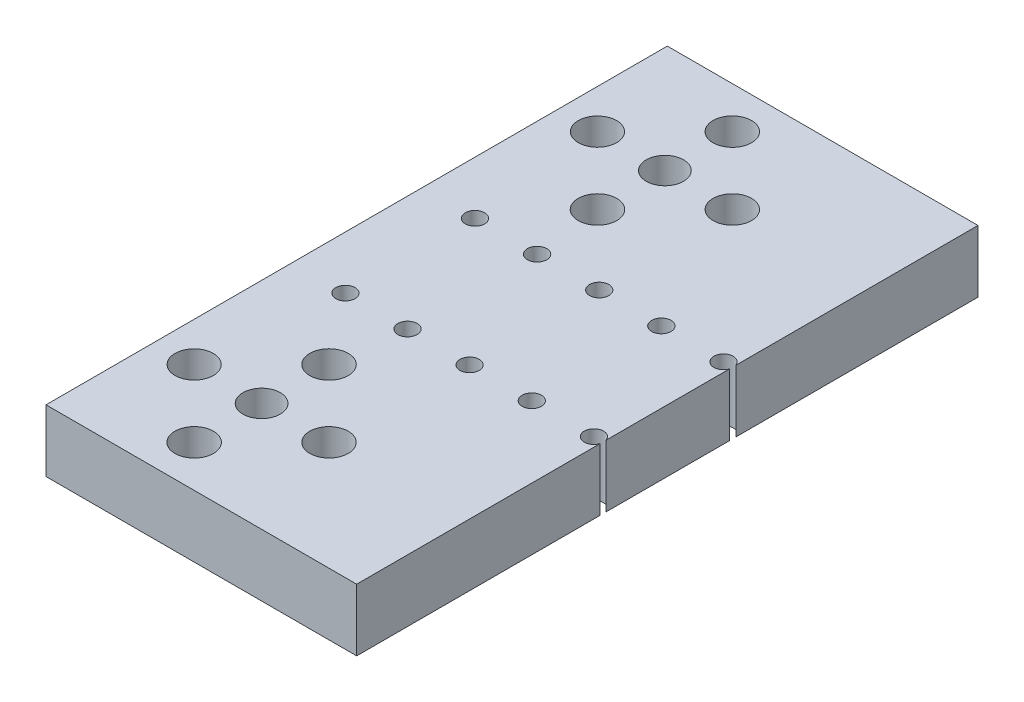
ISO-10303-21;
HEADER;
FILE_DESCRIPTION(('STEP AP214'),'2;1');
FILE_NAME('part.step','',(''),(''),'','','');
FILE_SCHEMA(('AUTOMOTIVE_DESIGN { 1 0 10303 214 1 1 1 1 }'));
ENDSEC;
DATA;
#1=APPLICATION_CONTEXT('core data for automotive mechanical design processes');
#2=APPLICATION_PROTOCOL_DEFINITION('international standard','automotive_design',2000,#1);
#3=PRODUCT_CONTEXT('',#1,'mechanical');
#4=PRODUCT('Part','Part','',(#3));
#5=PRODUCT_RELATED_PRODUCT_CATEGORY('part','',(#4));
#6=PRODUCT_DEFINITION_FORMATION('','',#4);
#7=PRODUCT_DEFINITION_CONTEXT('part definition',#1,'design');
#8=PRODUCT_DEFINITION('design','',#6,#7);
#9=PRODUCT_DEFINITION_SHAPE('','',#8);
#10=(LENGTH_UNIT() NAMED_UNIT(*) SI_UNIT(.MILLI.,.METRE.));
#11=(NAMED_UNIT(*) PLANE_ANGLE_UNIT() SI_UNIT($,.RADIAN.));
#12=(NAMED_UNIT(*) SI_UNIT($,.STERADIAN.) SOLID_ANGLE_UNIT());
#13=UNCERTAINTY_MEASURE_WITH_UNIT(LENGTH_MEASURE(1.E-05),#10,'distance_accuracy_value','');
#14=(GEOMETRIC_REPRESENTATION_CONTEXT(3) GLOBAL_UNCERTAINTY_ASSIGNED_CONTEXT((#13)) GLOBAL_UNIT_ASSIGNED_CONTEXT((#10,
#11,#12)) REPRESENTATION_CONTEXT('',''));
#15=CARTESIAN_POINT('',(0.,0.,0.));
#16=DIRECTION('',(0.,0.,1.));
#17=DIRECTION('',(1.,0.,0.));
#18=AXIS2_PLACEMENT_3D('',#15,#16,#17);
#19=CARTESIAN_POINT('',(0.,10.,50.));
#20=DIRECTION('',(-1.,0.,0.));
#21=DIRECTION('',(0.,0.,1.));
#22=AXIS2_PLACEMENT_3D('',#19,#20,#21);
#23=PLANE('',#22);
#24=DIRECTION('',(0.,0.,-1.));
#25=VECTOR('',#24,1.);
#26=CARTESIAN_POINT('',(0.,0.,50.));
#27=LINE('',#26,#25);
#28=CARTESIAN_POINT('',(0.,0.,50.));
#29=VERTEX_POINT('',#28);
#30=CARTESIAN_POINT('',(0.,0.,10.8216741232352));
#31=VERTEX_POINT('',#30);
#32=EDGE_CURVE('E137',#29,#31,#27,.T.);
#33=ORIENTED_EDGE('',*,*,#32,.T.);
#34=DIRECTION('',(0.,1.,0.));
#35=VECTOR('',#34,1.);
#36=CARTESIAN_POINT('',(0.,0.,10.8216741232352));
#37=LINE('',#36,#35);
#38=CARTESIAN_POINT('',(0.,10.,10.8216741232352));
#39=VERTEX_POINT('',#38);
#40=EDGE_CURVE('E302',#31,#39,#37,.T.);
#41=ORIENTED_EDGE('',*,*,#40,.T.);
#42=DIRECTION('',(0.,0.,-1.));
#43=VECTOR('',#42,1.);
#44=CARTESIAN_POINT('',(0.,10.,50.));
#45=LINE('',#44,#43);
#46=CARTESIAN_POINT('',(0.,10.,50.));
#47=VERTEX_POINT('',#46);
#48=EDGE_CURVE('E128',#47,#39,#45,.T.);
#49=ORIENTED_EDGE('',*,*,#48,.F.);
#50=DIRECTION('',(0.,-1.,0.));
#51=VECTOR('',#50,1.);
#52=CARTESIAN_POINT('',(0.,10.,50.));
#53=LINE('',#52,#51);
#54=EDGE_CURVE('E47',#47,#29,#53,.T.);
#55=ORIENTED_EDGE('',*,*,#54,.T.);
#56=EDGE_LOOP('',(#33,#41,#49,#55));
#57=FACE_BOUND('',#56,.T.);
#58=ADVANCED_FACE('F37',(#57),#23,.F.);
#59=CARTESIAN_POINT('',(0.,10.,9.86524091000437));
#60=VERTEX_POINT('',#59);
#61=CARTESIAN_POINT('',(0.,10.,-10.0134835313561));
#62=VERTEX_POINT('',#61);
#63=EDGE_CURVE('E143',#60,#62,#45,.T.);
#64=ORIENTED_EDGE('',*,*,#63,.F.);
#65=DIRECTION('',(0.,1.,0.));
#66=VECTOR('',#65,1.);
#67=CARTESIAN_POINT('',(0.,0.,9.86524091000437));
#68=LINE('',#67,#66);
#69=CARTESIAN_POINT('',(0.,0.,9.86524091000437));
#70=VERTEX_POINT('',#69);
#71=EDGE_CURVE('E74',#70,#60,#68,.T.);
#72=ORIENTED_EDGE('',*,*,#71,.F.);
#73=CARTESIAN_POINT('',(0.,0.,-10.0134835313561));
#74=VERTEX_POINT('',#73);
#75=EDGE_CURVE('E150',#70,#74,#27,.T.);
#76=ORIENTED_EDGE('',*,*,#75,.T.);
#77=DIRECTION('',(0.,1.,0.));
#78=VECTOR('',#77,1.);
#79=CARTESIAN_POINT('',(0.,0.,-10.0134835313561));
#80=LINE('',#79,#78);
#81=EDGE_CURVE('E56',#74,#62,#80,.T.);
#82=ORIENTED_EDGE('',*,*,#81,.T.);
#83=EDGE_LOOP('',(#64,#72,#76,#82));
#84=FACE_BOUND('',#83,.T.);
#85=ADVANCED_FACE('F343',(#84),#23,.F.);
#86=CARTESIAN_POINT('',(-50.,10.,50.));
#87=DIRECTION('',(1.,0.,0.));
#88=DIRECTION('',(0.,0.,-1.));
#89=AXIS2_PLACEMENT_3D('',#86,#87,#88);
#90=PLANE('',#89);
#91=DIRECTION('',(0.,0.,1.));
#92=VECTOR('',#91,1.);
#93=CARTESIAN_POINT('',(-50.,0.,50.));
#94=LINE('',#93,#92);
#95=CARTESIAN_POINT('',(-50.,0.,-50.));
#96=VERTEX_POINT('',#95);
#97=CARTESIAN_POINT('',(-50.,0.,50.));
#98=VERTEX_POINT('',#97);
#99=EDGE_CURVE('E145',#96,#98,#94,.T.);
#100=ORIENTED_EDGE('',*,*,#99,.T.);
#101=DIRECTION('',(0.,-1.,0.));
#102=VECTOR('',#101,1.);
#103=CARTESIAN_POINT('',(-50.,10.,50.));
#104=LINE('',#103,#102);
#105=CARTESIAN_POINT('',(-50.,10.,50.));
#106=VERTEX_POINT('',#105);
#107=EDGE_CURVE('E11',#106,#98,#104,.T.);
#108=ORIENTED_EDGE('',*,*,#107,.F.);
#109=DIRECTION('',(0.,0.,1.));
#110=VECTOR('',#109,1.);
#111=CARTESIAN_POINT('',(-50.,10.,50.));
#112=LINE('',#111,#110);
#113=CARTESIAN_POINT('',(-50.,10.,-50.));
#114=VERTEX_POINT('',#113);
#115=EDGE_CURVE('E125',#114,#106,#112,.T.);
#116=ORIENTED_EDGE('',*,*,#115,.F.);
#117=DIRECTION('',(0.,-1.,0.));
#118=VECTOR('',#117,1.);
#119=CARTESIAN_POINT('',(-50.,10.,-50.));
#120=LINE('',#119,#118);
#121=EDGE_CURVE('E127',#114,#96,#120,.T.);
#122=ORIENTED_EDGE('',*,*,#121,.T.);
#123=EDGE_LOOP('',(#100,#108,#116,#122));
#124=FACE_BOUND('',#123,.T.);
#125=ADVANCED_FACE('F39',(#124),#90,.F.);
#126=CARTESIAN_POINT('',(0.,10.,50.));
#127=DIRECTION('',(0.,0.,-1.));
#128=DIRECTION('',(-1.,0.,0.));
#129=AXIS2_PLACEMENT_3D('',#126,#127,#128);
#130=PLANE('',#129);
#131=DIRECTION('',(1.,0.,0.));
#132=VECTOR('',#131,1.);
#133=CARTESIAN_POINT('',(0.,0.,50.));
#134=LINE('',#133,#132);
#135=EDGE_CURVE('E85',#98,#29,#134,.T.);
#136=ORIENTED_EDGE('',*,*,#135,.T.);
#137=ORIENTED_EDGE('',*,*,#54,.F.);
#138=DIRECTION('',(1.,0.,0.));
#139=VECTOR('',#138,1.);
#140=CARTESIAN_POINT('',(0.,10.,50.));
#141=LINE('',#140,#139);
#142=EDGE_CURVE('E107',#106,#47,#141,.T.);
#143=ORIENTED_EDGE('',*,*,#142,.F.);
#144=ORIENTED_EDGE('',*,*,#107,.T.);
#145=EDGE_LOOP('',(#136,#137,#143,#144));
#146=FACE_BOUND('',#145,.T.);
#147=ADVANCED_FACE('F351',(#146),#130,.F.);
#148=CARTESIAN_POINT('',(0.,10.,-11.016927156555));
#149=VERTEX_POINT('',#148);
#150=CARTESIAN_POINT('',(0.,10.,-50.));
#151=VERTEX_POINT('',#150);
#152=EDGE_CURVE('E118',#149,#151,#45,.T.);
#153=ORIENTED_EDGE('',*,*,#152,.F.);
#154=DIRECTION('',(0.,1.,0.));
#155=VECTOR('',#154,1.);
#156=CARTESIAN_POINT('',(0.,0.,-11.016927156555));
#157=LINE('',#156,#155);
#158=CARTESIAN_POINT('',(0.,0.,-11.016927156555));
#159=VERTEX_POINT('',#158);
#160=EDGE_CURVE('E293',#159,#149,#157,.T.);
#161=ORIENTED_EDGE('',*,*,#160,.F.);
#162=CARTESIAN_POINT('',(0.,0.,-50.));
#163=VERTEX_POINT('',#162);
#164=EDGE_CURVE('E148',#159,#163,#27,.T.);
#165=ORIENTED_EDGE('',*,*,#164,.T.);
#166=DIRECTION('',(0.,-1.,0.));
#167=VECTOR('',#166,1.);
#168=CARTESIAN_POINT('',(0.,10.,-50.));
#169=LINE('',#168,#167);
#170=EDGE_CURVE('E133',#151,#163,#169,.T.);
#171=ORIENTED_EDGE('',*,*,#170,.F.);
#172=EDGE_LOOP('',(#153,#161,#165,#171));
#173=FACE_BOUND('',#172,.T.);
#174=ADVANCED_FACE('F292',(#173),#23,.F.);
#175=CARTESIAN_POINT('',(0.,10.,-50.));
#176=DIRECTION('',(0.,0.,1.));
#177=DIRECTION('',(1.,0.,0.));
#178=AXIS2_PLACEMENT_3D('',#175,#176,#177);
#179=PLANE('',#178);
#180=DIRECTION('',(-1.,0.,0.));
#181=VECTOR('',#180,1.);
#182=CARTESIAN_POINT('',(0.,0.,-50.));
#183=LINE('',#182,#181);
#184=EDGE_CURVE('E99',#163,#96,#183,.T.);
#185=ORIENTED_EDGE('',*,*,#184,.T.);
#186=ORIENTED_EDGE('',*,*,#121,.F.);
#187=DIRECTION('',(-1.,0.,0.));
#188=VECTOR('',#187,1.);
#189=CARTESIAN_POINT('',(0.,10.,-50.));
#190=LINE('',#189,#188);
#191=EDGE_CURVE('E121',#151,#114,#190,.T.);
#192=ORIENTED_EDGE('',*,*,#191,.F.);
#193=ORIENTED_EDGE('',*,*,#170,.T.);
#194=EDGE_LOOP('',(#185,#186,#192,#193));
#195=FACE_BOUND('',#194,.T.);
#196=ADVANCED_FACE('F130',(#195),#179,.F.);
#197=CARTESIAN_POINT('',(0.,10.,0.));
#198=DIRECTION('',(0.,1.,0.));
#199=DIRECTION('',(0.,0.,1.));
#200=AXIS2_PLACEMENT_3D('',#197,#198,#199);
#201=PLANE('',#200);
#202=CARTESIAN_POINT('',(-21.4743842366077,10.,10.3434575166198));
#203=DIRECTION('',(0.,1.,0.));
#204=DIRECTION('',(0.,0.,1.));
#205=AXIS2_PLACEMENT_3D('',#202,#203,#204);
#206=CIRCLE('',#205,1.54999999999999);
#207=CARTESIAN_POINT('',(-21.4743842366077,10.,11.8934575166198));
#208=VERTEX_POINT('',#207);
#209=EDGE_CURVE('E184',#208,#208,#206,.T.);
#210=ORIENTED_EDGE('',*,*,#209,.F.);
#211=EDGE_LOOP('',(#210));
#212=FACE_BOUND('',#211,.T.);
#213=CARTESIAN_POINT('',(-11.4743842366077,10.,10.3434575166198));
#214=DIRECTION('',(0.,1.,0.));
#215=DIRECTION('',(0.,0.,1.));
#216=AXIS2_PLACEMENT_3D('',#213,#214,#215);
#217=CIRCLE('',#216,1.54999999999999);
#218=CARTESIAN_POINT('',(-11.4743842366077,10.,11.8934575166198));
#219=VERTEX_POINT('',#218);
#220=EDGE_CURVE('E181',#219,#219,#217,.T.);
#221=ORIENTED_EDGE('',*,*,#220,.F.);
#222=EDGE_LOOP('',(#221));
#223=FACE_BOUND('',#222,.T.);
#224=CARTESIAN_POINT('',(-1.47438423660768,10.,10.3434575166198));
#225=DIRECTION('',(0.,1.,0.));
#226=DIRECTION('',(0.,0.,1.));
#227=AXIS2_PLACEMENT_3D('',#224,#225,#226);
#228=CIRCLE('',#227,1.54999999999999);
#229=EDGE_CURVE('E41',#60,#39,#228,.T.);
#230=ORIENTED_EDGE('',*,*,#229,.F.);
#231=ORIENTED_EDGE('',*,*,#63,.T.);
#232=CARTESIAN_POINT('',(-1.47438423660769,10.,-10.5152053439555));
#233=DIRECTION('',(0.,1.,0.));
#234=DIRECTION('',(0.,0.,1.));
#235=AXIS2_PLACEMENT_3D('',#232,#233,#234);
#236=CIRCLE('',#235,1.55741248691389);
#237=EDGE_CURVE('E154',#149,#62,#236,.T.);
#238=ORIENTED_EDGE('',*,*,#237,.F.);
#239=ORIENTED_EDGE('',*,*,#152,.T.);
#240=ORIENTED_EDGE('',*,*,#191,.T.);
#241=ORIENTED_EDGE('',*,*,#115,.T.);
#242=ORIENTED_EDGE('',*,*,#142,.T.);
#243=ORIENTED_EDGE('',*,*,#48,.T.);
#244=EDGE_LOOP('',(#230,#231,#238,#239,#240,#241,#242,#243));
#245=FACE_BOUND('',#244,.T.);
#246=CARTESIAN_POINT('',(-11.4743842366077,10.,-10.5152053439555));
#247=DIRECTION('',(0.,1.,0.));
#248=DIRECTION('',(0.,0.,1.));
#249=AXIS2_PLACEMENT_3D('',#246,#247,#248);
#250=CIRCLE('',#249,1.55741248691389);
#251=CARTESIAN_POINT('',(-11.4743842366077,10.,-8.95779285704164));
#252=VERTEX_POINT('',#251);
#253=EDGE_CURVE('E178',#252,#252,#250,.T.);
#254=ORIENTED_EDGE('',*,*,#253,.F.);
#255=EDGE_LOOP('',(#254));
#256=FACE_BOUND('',#255,.T.);
#257=CARTESIAN_POINT('',(-21.4743842366077,10.,-10.5152053439555));
#258=DIRECTION('',(0.,1.,0.));
#259=DIRECTION('',(0.,0.,1.));
#260=AXIS2_PLACEMENT_3D('',#257,#258,#259);
#261=CIRCLE('',#260,1.55);
#262=CARTESIAN_POINT('',(-21.4743842366077,10.,-8.96520534395554));
#263=VERTEX_POINT('',#262);
#264=EDGE_CURVE('E175',#263,#263,#261,.T.);
#265=ORIENTED_EDGE('',*,*,#264,.F.);
#266=EDGE_LOOP('',(#265));
#267=FACE_BOUND('',#266,.T.);
#268=CARTESIAN_POINT('',(-31.4743842366077,10.,-10.5152053439555));
#269=DIRECTION('',(0.,1.,0.));
#270=DIRECTION('',(0.,0.,1.));
#271=AXIS2_PLACEMENT_3D('',#268,#269,#270);
#272=CIRCLE('',#271,1.55741248691389);
#273=CARTESIAN_POINT('',(-31.4743842366077,10.,-8.95779285704164));
#274=VERTEX_POINT('',#273);
#275=EDGE_CURVE('E172',#274,#274,#272,.T.);
#276=ORIENTED_EDGE('',*,*,#275,.F.);
#277=EDGE_LOOP('',(#276));
#278=FACE_BOUND('',#277,.T.);
#279=CARTESIAN_POINT('',(-31.4743842366077,10.,10.3434575166198));
#280=DIRECTION('',(0.,1.,0.));
#281=DIRECTION('',(0.,0.,1.));
#282=AXIS2_PLACEMENT_3D('',#279,#280,#281);
#283=CIRCLE('',#282,1.54999999999999);
#284=CARTESIAN_POINT('',(-31.4743842366077,10.,11.8934575166198));
#285=VERTEX_POINT('',#284);
#286=EDGE_CURVE('E158',#285,#285,#283,.T.);
#287=ORIENTED_EDGE('',*,*,#286,.F.);
#288=EDGE_LOOP('',(#287));
#289=FACE_BOUND('',#288,.T.);
#290=CARTESIAN_POINT('',(-41.4743842366077,10.,10.3434575166198));
#291=DIRECTION('',(0.,1.,0.));
#292=DIRECTION('',(0.,0.,1.));
#293=AXIS2_PLACEMENT_3D('',#290,#291,#292);
#294=CIRCLE('',#293,1.54999999999999);
#295=CARTESIAN_POINT('',(-41.4743842366077,10.,11.8934575166198));
#296=VERTEX_POINT('',#295);
#297=EDGE_CURVE('E155',#296,#296,#294,.T.);
#298=ORIENTED_EDGE('',*,*,#297,.F.);
#299=EDGE_LOOP('',(#298));
#300=FACE_BOUND('',#299,.T.);
#301=CARTESIAN_POINT('',(-41.4743842366077,10.,-10.5152053439555));
#302=DIRECTION('',(0.,1.,0.));
#303=DIRECTION('',(0.,0.,1.));
#304=AXIS2_PLACEMENT_3D('',#301,#302,#303);
#305=CIRCLE('',#304,1.55741248691389);
#306=CARTESIAN_POINT('',(-41.4743842366077,10.,-8.95779285704164));
#307=VERTEX_POINT('',#306);
#308=EDGE_CURVE('E156',#307,#307,#305,.T.);
#309=ORIENTED_EDGE('',*,*,#308,.F.);
#310=EDGE_LOOP('',(#309));
#311=FACE_BOUND('',#310,.T.);
#312=CARTESIAN_POINT('',(-32.8473086233618,10.,43.305370298214));
#313=DIRECTION('',(0.,1.,0.));
#314=DIRECTION('',(0.,0.,1.));
#315=AXIS2_PLACEMENT_3D('',#312,#313,#314);
#316=CIRCLE('',#315,3.10436221529379);
#317=CARTESIAN_POINT('',(-32.8473086233618,10.,46.4097325135078));
#318=VERTEX_POINT('',#317);
#319=EDGE_CURVE('E140',#318,#318,#316,.T.);
#320=ORIENTED_EDGE('',*,*,#319,.F.);
#321=EDGE_LOOP('',(#320));
#322=FACE_BOUND('',#321,.T.);
#323=CARTESIAN_POINT('',(-32.8473086233618,10.,32.453891525012));
#324=DIRECTION('',(0.,1.,0.));
#325=DIRECTION('',(0.,0.,1.));
#326=AXIS2_PLACEMENT_3D('',#323,#324,#325);
#327=CIRCLE('',#326,3.00452464943322);
#328=CARTESIAN_POINT('',(-32.8473086233618,10.,35.4584161744453));
#329=VERTEX_POINT('',#328);
#330=EDGE_CURVE('E240',#329,#329,#327,.T.);
#331=ORIENTED_EDGE('',*,*,#330,.F.);
#332=EDGE_LOOP('',(#331));
#333=FACE_BOUND('',#332,.T.);
#334=CARTESIAN_POINT('',(-32.8473086233618,10.,21.6024127518101));
#335=DIRECTION('',(0.,1.,0.));
#336=DIRECTION('',(0.,0.,1.));
#337=AXIS2_PLACEMENT_3D('',#334,#335,#336);
#338=CIRCLE('',#337,3.10436221529379);
#339=CARTESIAN_POINT('',(-32.8473086233618,10.,24.7067749671039));
#340=VERTEX_POINT('',#339);
#341=EDGE_CURVE('E238',#340,#340,#338,.T.);
#342=ORIENTED_EDGE('',*,*,#341,.F.);
#343=EDGE_LOOP('',(#342));
#344=FACE_BOUND('',#343,.T.);
#345=CARTESIAN_POINT('',(-21.9958298501599,10.,32.453891525012));
#346=DIRECTION('',(0.,1.,0.));
#347=DIRECTION('',(0.,0.,1.));
#348=AXIS2_PLACEMENT_3D('',#345,#346,#347);
#349=CIRCLE('',#348,3.1);
#350=CARTESIAN_POINT('',(-21.9958298501599,10.,35.553891525012));
#351=VERTEX_POINT('',#350);
#352=EDGE_CURVE('E235',#351,#351,#349,.T.);
#353=ORIENTED_EDGE('',*,*,#352,.F.);
#354=EDGE_LOOP('',(#353));
#355=FACE_BOUND('',#354,.T.);
#356=CARTESIAN_POINT('',(-43.6987873965638,10.,32.453891525012));
#357=DIRECTION('',(0.,1.,0.));
#358=DIRECTION('',(0.,0.,1.));
#359=AXIS2_PLACEMENT_3D('',#356,#357,#358);
#360=CIRCLE('',#359,3.08515839456066);
#361=CARTESIAN_POINT('',(-43.6987873965638,10.,35.5390499195727));
#362=VERTEX_POINT('',#361);
#363=EDGE_CURVE('E232',#362,#362,#360,.T.);
#364=ORIENTED_EDGE('',*,*,#363,.F.);
#365=EDGE_LOOP('',(#364));
#366=FACE_BOUND('',#365,.T.);
#367=CARTESIAN_POINT('',(-43.6987873965638,10.,-32.453891525012));
#368=DIRECTION('',(0.,1.,0.));
#369=DIRECTION('',(0.,0.,1.));
#370=AXIS2_PLACEMENT_3D('',#367,#368,#369);
#371=CIRCLE('',#370,3.08515839456066);
#372=CARTESIAN_POINT('',(-43.6987873965638,10.,-29.3687331304514));
#373=VERTEX_POINT('',#372);
#374=EDGE_CURVE('E229',#373,#373,#371,.T.);
#375=ORIENTED_EDGE('',*,*,#374,.F.);
#376=EDGE_LOOP('',(#375));
#377=FACE_BOUND('',#376,.T.);
#378=CARTESIAN_POINT('',(-21.9958298501599,10.,-32.453891525012));
#379=DIRECTION('',(0.,1.,0.));
#380=DIRECTION('',(0.,0.,1.));
#381=AXIS2_PLACEMENT_3D('',#378,#379,#380);
#382=CIRCLE('',#381,3.1);
#383=CARTESIAN_POINT('',(-21.9958298501599,10.,-29.353891525012));
#384=VERTEX_POINT('',#383);
#385=EDGE_CURVE('E226',#384,#384,#382,.T.);
#386=ORIENTED_EDGE('',*,*,#385,.F.);
#387=EDGE_LOOP('',(#386));
#388=FACE_BOUND('',#387,.T.);
#389=CARTESIAN_POINT('',(-32.8473086233618,10.,-21.6024127518101));
#390=DIRECTION('',(0.,1.,0.));
#391=DIRECTION('',(0.,0.,1.));
#392=AXIS2_PLACEMENT_3D('',#389,#390,#391);
#393=CIRCLE('',#392,3.10436221529379);
#394=CARTESIAN_POINT('',(-32.8473086233618,10.,-18.4980505365163));
#395=VERTEX_POINT('',#394);
#396=EDGE_CURVE('E223',#395,#395,#393,.T.);
#397=ORIENTED_EDGE('',*,*,#396,.F.);
#398=EDGE_LOOP('',(#397));
#399=FACE_BOUND('',#398,.T.);
#400=CARTESIAN_POINT('',(-32.8473086233618,10.,-32.453891525012));
#401=DIRECTION('',(0.,1.,0.));
#402=DIRECTION('',(0.,0.,1.));
#403=AXIS2_PLACEMENT_3D('',#400,#401,#402);
#404=CIRCLE('',#403,3.00452464943322);
#405=CARTESIAN_POINT('',(-32.8473086233618,10.,-29.4493668755788));
#406=VERTEX_POINT('',#405);
#407=EDGE_CURVE('E220',#406,#406,#404,.T.);
#408=ORIENTED_EDGE('',*,*,#407,.F.);
#409=EDGE_LOOP('',(#408));
#410=FACE_BOUND('',#409,.T.);
#411=CARTESIAN_POINT('',(-32.8473086233618,10.,-43.305370298214));
#412=DIRECTION('',(0.,1.,0.));
#413=DIRECTION('',(0.,0.,1.));
#414=AXIS2_PLACEMENT_3D('',#411,#412,#413);
#415=CIRCLE('',#414,3.10436221529379);
#416=CARTESIAN_POINT('',(-32.8473086233618,10.,-40.2010080829202));
#417=VERTEX_POINT('',#416);
#418=EDGE_CURVE('E191',#417,#417,#415,.T.);
#419=ORIENTED_EDGE('',*,*,#418,.F.);
#420=EDGE_LOOP('',(#419));
#421=FACE_BOUND('',#420,.T.);
#422=ADVANCED_FACE('F122',(#212,#223,#245,#256,#267,#278,#289,#300,#311,#322,#333,#344,#355,
#366,#377,#388,#399,#410,#421),#201,.T.);
#423=CARTESIAN_POINT('',(0.,0.,0.));
#424=DIRECTION('',(0.,1.,0.));
#425=DIRECTION('',(0.,0.,1.));
#426=AXIS2_PLACEMENT_3D('',#423,#424,#425);
#427=PLANE('',#426);
#428=CARTESIAN_POINT('',(-21.4743842366077,0.,10.3434575166198));
#429=DIRECTION('',(0.,1.,0.));
#430=DIRECTION('',(0.,0.,1.));
#431=AXIS2_PLACEMENT_3D('',#428,#429,#430);
#432=CIRCLE('',#431,1.54999999999999);
#433=CARTESIAN_POINT('',(-21.4743842366077,0.,11.8934575166198));
#434=VERTEX_POINT('',#433);
#435=EDGE_CURVE('E307',#434,#434,#432,.T.);
#436=ORIENTED_EDGE('',*,*,#435,.T.);
#437=EDGE_LOOP('',(#436));
#438=FACE_BOUND('',#437,.T.);
#439=CARTESIAN_POINT('',(-11.4743842366077,0.,10.3434575166198));
#440=DIRECTION('',(0.,1.,0.));
#441=DIRECTION('',(0.,0.,1.));
#442=AXIS2_PLACEMENT_3D('',#439,#440,#441);
#443=CIRCLE('',#442,1.54999999999999);
#444=CARTESIAN_POINT('',(-11.4743842366077,0.,11.8934575166198));
#445=VERTEX_POINT('',#444);
#446=EDGE_CURVE('E304',#445,#445,#443,.T.);
#447=ORIENTED_EDGE('',*,*,#446,.T.);
#448=EDGE_LOOP('',(#447));
#449=FACE_BOUND('',#448,.T.);
#450=CARTESIAN_POINT('',(-11.4743842366077,0.,-10.5152053439555));
#451=DIRECTION('',(0.,1.,0.));
#452=DIRECTION('',(0.,0.,1.));
#453=AXIS2_PLACEMENT_3D('',#450,#451,#452);
#454=CIRCLE('',#453,1.55741248691389);
#455=CARTESIAN_POINT('',(-11.4743842366077,0.,-8.95779285704164));
#456=VERTEX_POINT('',#455);
#457=EDGE_CURVE('E299',#456,#456,#454,.T.);
#458=ORIENTED_EDGE('',*,*,#457,.T.);
#459=EDGE_LOOP('',(#458));
#460=FACE_BOUND('',#459,.T.);
#461=CARTESIAN_POINT('',(-21.4743842366077,0.,-10.5152053439555));
#462=DIRECTION('',(0.,1.,0.));
#463=DIRECTION('',(0.,0.,1.));
#464=AXIS2_PLACEMENT_3D('',#461,#462,#463);
#465=CIRCLE('',#464,1.55);
#466=CARTESIAN_POINT('',(-21.4743842366077,0.,-8.96520534395554));
#467=VERTEX_POINT('',#466);
#468=EDGE_CURVE('E310',#467,#467,#465,.T.);
#469=ORIENTED_EDGE('',*,*,#468,.T.);
#470=EDGE_LOOP('',(#469));
#471=FACE_BOUND('',#470,.T.);
#472=CARTESIAN_POINT('',(-31.4743842366077,0.,-10.5152053439555));
#473=DIRECTION('',(0.,1.,0.));
#474=DIRECTION('',(0.,0.,1.));
#475=AXIS2_PLACEMENT_3D('',#472,#473,#474);
#476=CIRCLE('',#475,1.55741248691389);
#477=CARTESIAN_POINT('',(-31.4743842366077,0.,-8.95779285704164));
#478=VERTEX_POINT('',#477);
#479=EDGE_CURVE('E318',#478,#478,#476,.T.);
#480=ORIENTED_EDGE('',*,*,#479,.T.);
#481=EDGE_LOOP('',(#480));
#482=FACE_BOUND('',#481,.T.);
#483=CARTESIAN_POINT('',(-31.4743842366077,0.,10.3434575166198));
#484=DIRECTION('',(0.,1.,0.));
#485=DIRECTION('',(0.,0.,1.));
#486=AXIS2_PLACEMENT_3D('',#483,#484,#485);
#487=CIRCLE('',#486,1.54999999999999);
#488=CARTESIAN_POINT('',(-31.4743842366077,0.,11.8934575166198));
#489=VERTEX_POINT('',#488);
#490=EDGE_CURVE('E315',#489,#489,#487,.T.);
#491=ORIENTED_EDGE('',*,*,#490,.T.);
#492=EDGE_LOOP('',(#491));
#493=FACE_BOUND('',#492,.T.);
#494=CARTESIAN_POINT('',(-41.4743842366077,0.,10.3434575166198));
#495=DIRECTION('',(0.,1.,0.));
#496=DIRECTION('',(0.,0.,1.));
#497=AXIS2_PLACEMENT_3D('',#494,#495,#496);
#498=CIRCLE('',#497,1.54999999999999);
#499=CARTESIAN_POINT('',(-41.4743842366077,0.,11.8934575166198));
#500=VERTEX_POINT('',#499);
#501=EDGE_CURVE('E166',#500,#500,#498,.T.);
#502=ORIENTED_EDGE('',*,*,#501,.T.);
#503=EDGE_LOOP('',(#502));
#504=FACE_BOUND('',#503,.T.);
#505=CARTESIAN_POINT('',(-41.4743842366077,0.,-10.5152053439555));
#506=DIRECTION('',(0.,1.,0.));
#507=DIRECTION('',(0.,0.,1.));
#508=AXIS2_PLACEMENT_3D('',#505,#506,#507);
#509=CIRCLE('',#508,1.55741248691389);
#510=CARTESIAN_POINT('',(-41.4743842366077,0.,-8.95779285704164));
#511=VERTEX_POINT('',#510);
#512=EDGE_CURVE('E161',#511,#511,#509,.T.);
#513=ORIENTED_EDGE('',*,*,#512,.T.);
#514=EDGE_LOOP('',(#513));
#515=FACE_BOUND('',#514,.T.);
#516=CARTESIAN_POINT('',(-32.8473086233618,0.,43.305370298214));
#517=DIRECTION('',(0.,1.,0.));
#518=DIRECTION('',(0.,0.,1.));
#519=AXIS2_PLACEMENT_3D('',#516,#517,#518);
#520=CIRCLE('',#519,3.10436221529379);
#521=CARTESIAN_POINT('',(-32.8473086233618,0.,46.4097325135078));
#522=VERTEX_POINT('',#521);
#523=EDGE_CURVE('E188',#522,#522,#520,.T.);
#524=ORIENTED_EDGE('',*,*,#523,.T.);
#525=EDGE_LOOP('',(#524));
#526=FACE_BOUND('',#525,.T.);
#527=CARTESIAN_POINT('',(-32.8473086233618,0.,32.453891525012));
#528=DIRECTION('',(0.,1.,0.));
#529=DIRECTION('',(0.,0.,1.));
#530=AXIS2_PLACEMENT_3D('',#527,#528,#529);
#531=CIRCLE('',#530,3.00452464943322);
#532=CARTESIAN_POINT('',(-32.8473086233618,0.,35.4584161744453));
#533=VERTEX_POINT('',#532);
#534=EDGE_CURVE('E197',#533,#533,#531,.T.);
#535=ORIENTED_EDGE('',*,*,#534,.T.);
#536=EDGE_LOOP('',(#535));
#537=FACE_BOUND('',#536,.T.);
#538=CARTESIAN_POINT('',(-32.8473086233618,0.,21.6024127518101));
#539=DIRECTION('',(0.,1.,0.));
#540=DIRECTION('',(0.,0.,1.));
#541=AXIS2_PLACEMENT_3D('',#538,#539,#540);
#542=CIRCLE('',#541,3.10436221529379);
#543=CARTESIAN_POINT('',(-32.8473086233618,0.,24.7067749671039));
#544=VERTEX_POINT('',#543);
#545=EDGE_CURVE('E193',#544,#544,#542,.T.);
#546=ORIENTED_EDGE('',*,*,#545,.T.);
#547=EDGE_LOOP('',(#546));
#548=FACE_BOUND('',#547,.T.);
#549=CARTESIAN_POINT('',(-21.9958298501599,0.,32.453891525012));
#550=DIRECTION('',(0.,1.,0.));
#551=DIRECTION('',(0.,0.,1.));
#552=AXIS2_PLACEMENT_3D('',#549,#550,#551);
#553=CIRCLE('',#552,3.1);
#554=CARTESIAN_POINT('',(-21.9958298501599,0.,35.553891525012));
#555=VERTEX_POINT('',#554);
#556=EDGE_CURVE('E196',#555,#555,#553,.T.);
#557=ORIENTED_EDGE('',*,*,#556,.T.);
#558=EDGE_LOOP('',(#557));
#559=FACE_BOUND('',#558,.T.);
#560=CARTESIAN_POINT('',(-43.6987873965638,0.,32.453891525012));
#561=DIRECTION('',(0.,1.,0.));
#562=DIRECTION('',(0.,0.,1.));
#563=AXIS2_PLACEMENT_3D('',#560,#561,#562);
#564=CIRCLE('',#563,3.08515839456066);
#565=CARTESIAN_POINT('',(-43.6987873965638,0.,35.5390499195727));
#566=VERTEX_POINT('',#565);
#567=EDGE_CURVE('E192',#566,#566,#564,.T.);
#568=ORIENTED_EDGE('',*,*,#567,.T.);
#569=EDGE_LOOP('',(#568));
#570=FACE_BOUND('',#569,.T.);
#571=CARTESIAN_POINT('',(-43.6987873965638,0.,-32.453891525012));
#572=DIRECTION('',(0.,1.,0.));
#573=DIRECTION('',(0.,0.,-1.));
#574=AXIS2_PLACEMENT_3D('',#571,#572,#573);
#575=CIRCLE('',#574,3.08515839456066);
#576=CARTESIAN_POINT('',(-43.6987873965638,0.,-35.5390499195727));
#577=VERTEX_POINT('',#576);
#578=EDGE_CURVE('E209',#577,#577,#575,.T.);
#579=ORIENTED_EDGE('',*,*,#578,.T.);
#580=EDGE_LOOP('',(#579));
#581=FACE_BOUND('',#580,.T.);
#582=CARTESIAN_POINT('',(-21.9958298501599,0.,-32.453891525012));
#583=DIRECTION('',(0.,1.,0.));
#584=DIRECTION('',(0.,0.,-1.));
#585=AXIS2_PLACEMENT_3D('',#582,#583,#584);
#586=CIRCLE('',#585,3.1);
#587=CARTESIAN_POINT('',(-21.9958298501599,0.,-35.553891525012));
#588=VERTEX_POINT('',#587);
#589=EDGE_CURVE('E205',#588,#588,#586,.T.);
#590=ORIENTED_EDGE('',*,*,#589,.T.);
#591=EDGE_LOOP('',(#590));
#592=FACE_BOUND('',#591,.T.);
#593=CARTESIAN_POINT('',(-32.8473086233618,0.,-21.6024127518101));
#594=DIRECTION('',(0.,1.,0.));
#595=DIRECTION('',(0.,0.,-1.));
#596=AXIS2_PLACEMENT_3D('',#593,#594,#595);
#597=CIRCLE('',#596,3.10436221529379);
#598=CARTESIAN_POINT('',(-32.8473086233618,0.,-24.7067749671039));
#599=VERTEX_POINT('',#598);
#600=EDGE_CURVE('E208',#599,#599,#597,.T.);
#601=ORIENTED_EDGE('',*,*,#600,.T.);
#602=EDGE_LOOP('',(#601));
#603=FACE_BOUND('',#602,.T.);
#604=CARTESIAN_POINT('',(-32.8473086233618,0.,-32.453891525012));
#605=DIRECTION('',(0.,1.,0.));
#606=DIRECTION('',(0.,0.,-1.));
#607=AXIS2_PLACEMENT_3D('',#604,#605,#606);
#608=CIRCLE('',#607,3.00452464943322);
#609=CARTESIAN_POINT('',(-32.8473086233618,0.,-35.4584161744453));
#610=VERTEX_POINT('',#609);
#611=EDGE_CURVE('E200',#610,#610,#608,.T.);
#612=ORIENTED_EDGE('',*,*,#611,.T.);
#613=EDGE_LOOP('',(#612));
#614=FACE_BOUND('',#613,.T.);
#615=CARTESIAN_POINT('',(-32.8473086233618,0.,-43.305370298214));
#616=DIRECTION('',(0.,1.,0.));
#617=DIRECTION('',(0.,0.,-1.));
#618=AXIS2_PLACEMENT_3D('',#615,#616,#617);
#619=CIRCLE('',#618,3.10436221529379);
#620=CARTESIAN_POINT('',(-32.8473086233618,0.,-46.4097325135078));
#621=VERTEX_POINT('',#620);
#622=EDGE_CURVE('E187',#621,#621,#619,.T.);
#623=ORIENTED_EDGE('',*,*,#622,.T.);
#624=EDGE_LOOP('',(#623));
#625=FACE_BOUND('',#624,.T.);
#626=ORIENTED_EDGE('',*,*,#75,.F.);
#627=CARTESIAN_POINT('',(-1.47438423660768,0.,10.3434575166198));
#628=DIRECTION('',(0.,1.,0.));
#629=DIRECTION('',(0.,0.,1.));
#630=AXIS2_PLACEMENT_3D('',#627,#628,#629);
#631=CIRCLE('',#630,1.54999999999999);
#632=EDGE_CURVE('E285',#70,#31,#631,.T.);
#633=ORIENTED_EDGE('',*,*,#632,.T.);
#634=ORIENTED_EDGE('',*,*,#32,.F.);
#635=ORIENTED_EDGE('',*,*,#135,.F.);
#636=ORIENTED_EDGE('',*,*,#99,.F.);
#637=ORIENTED_EDGE('',*,*,#184,.F.);
#638=ORIENTED_EDGE('',*,*,#164,.F.);
#639=CARTESIAN_POINT('',(-1.47438423660769,0.,-10.5152053439555));
#640=DIRECTION('',(0.,1.,0.));
#641=DIRECTION('',(0.,0.,1.));
#642=AXIS2_PLACEMENT_3D('',#639,#640,#641);
#643=CIRCLE('',#642,1.55741248691389);
#644=EDGE_CURVE('E287',#159,#74,#643,.T.);
#645=ORIENTED_EDGE('',*,*,#644,.T.);
#646=EDGE_LOOP('',(#626,#633,#634,#635,#636,#637,#638,#645));
#647=FACE_BOUND('',#646,.T.);
#648=ADVANCED_FACE('F252',(#438,#449,#460,#471,#482,#493,#504,#515,#526,#537,#548,#559,#570,
#581,#592,#603,#614,#625,#647),#427,.F.);
#649=CARTESIAN_POINT('',(-32.8473086233618,0.,-43.305370298214));
#650=DIRECTION('',(0.,1.,0.));
#651=DIRECTION('',(0.,0.,1.));
#652=AXIS2_PLACEMENT_3D('',#649,#650,#651);
#653=CYLINDRICAL_SURFACE('',#652,3.10436221529379);
#654=ORIENTED_EDGE('',*,*,#418,.T.);
#655=EDGE_LOOP('',(#654));
#656=FACE_BOUND('',#655,.T.);
#657=ORIENTED_EDGE('',*,*,#622,.F.);
#658=EDGE_LOOP('',(#657));
#659=FACE_BOUND('',#658,.T.);
#660=ADVANCED_FACE('F272',(#656,#659),#653,.F.);
#661=CARTESIAN_POINT('',(-32.8473086233618,0.,-32.453891525012));
#662=DIRECTION('',(0.,1.,0.));
#663=DIRECTION('',(0.,0.,1.));
#664=AXIS2_PLACEMENT_3D('',#661,#662,#663);
#665=CYLINDRICAL_SURFACE('',#664,3.00452464943322);
#666=ORIENTED_EDGE('',*,*,#407,.T.);
#667=EDGE_LOOP('',(#666));
#668=FACE_BOUND('',#667,.T.);
#669=ORIENTED_EDGE('',*,*,#611,.F.);
#670=EDGE_LOOP('',(#669));
#671=FACE_BOUND('',#670,.T.);
#672=ADVANCED_FACE('F275',(#668,#671),#665,.F.);
#673=CARTESIAN_POINT('',(-32.8473086233618,0.,-21.6024127518101));
#674=DIRECTION('',(0.,1.,0.));
#675=DIRECTION('',(0.,0.,1.));
#676=AXIS2_PLACEMENT_3D('',#673,#674,#675);
#677=CYLINDRICAL_SURFACE('',#676,3.10436221529379);
#678=ORIENTED_EDGE('',*,*,#396,.T.);
#679=EDGE_LOOP('',(#678));
#680=FACE_BOUND('',#679,.T.);
#681=ORIENTED_EDGE('',*,*,#600,.F.);
#682=EDGE_LOOP('',(#681));
#683=FACE_BOUND('',#682,.T.);
#684=ADVANCED_FACE('F413',(#680,#683),#677,.F.);
#685=CARTESIAN_POINT('',(-21.9958298501599,0.,-32.453891525012));
#686=DIRECTION('',(0.,1.,0.));
#687=DIRECTION('',(0.,0.,1.));
#688=AXIS2_PLACEMENT_3D('',#685,#686,#687);
#689=CYLINDRICAL_SURFACE('',#688,3.1);
#690=ORIENTED_EDGE('',*,*,#385,.T.);
#691=EDGE_LOOP('',(#690));
#692=FACE_BOUND('',#691,.T.);
#693=ORIENTED_EDGE('',*,*,#589,.F.);
#694=EDGE_LOOP('',(#693));
#695=FACE_BOUND('',#694,.T.);
#696=ADVANCED_FACE('F419',(#692,#695),#689,.F.);
#697=CARTESIAN_POINT('',(-43.6987873965638,0.,-32.453891525012));
#698=DIRECTION('',(0.,1.,0.));
#699=DIRECTION('',(0.,0.,1.));
#700=AXIS2_PLACEMENT_3D('',#697,#698,#699);
#701=CYLINDRICAL_SURFACE('',#700,3.08515839456066);
#702=ORIENTED_EDGE('',*,*,#374,.T.);
#703=EDGE_LOOP('',(#702));
#704=FACE_BOUND('',#703,.T.);
#705=ORIENTED_EDGE('',*,*,#578,.F.);
#706=EDGE_LOOP('',(#705));
#707=FACE_BOUND('',#706,.T.);
#708=ADVANCED_FACE('F423',(#704,#707),#701,.F.);
#709=CARTESIAN_POINT('',(-43.6987873965638,0.,32.453891525012));
#710=DIRECTION('',(0.,1.,0.));
#711=DIRECTION('',(0.,0.,1.));
#712=AXIS2_PLACEMENT_3D('',#709,#710,#711);
#713=CYLINDRICAL_SURFACE('',#712,3.08515839456066);
#714=ORIENTED_EDGE('',*,*,#363,.T.);
#715=EDGE_LOOP('',(#714));
#716=FACE_BOUND('',#715,.T.);
#717=ORIENTED_EDGE('',*,*,#567,.F.);
#718=EDGE_LOOP('',(#717));
#719=FACE_BOUND('',#718,.T.);
#720=ADVANCED_FACE('F426',(#716,#719),#713,.F.);
#721=CARTESIAN_POINT('',(-21.9958298501599,0.,32.453891525012));
#722=DIRECTION('',(0.,1.,0.));
#723=DIRECTION('',(0.,0.,1.));
#724=AXIS2_PLACEMENT_3D('',#721,#722,#723);
#725=CYLINDRICAL_SURFACE('',#724,3.1);
#726=ORIENTED_EDGE('',*,*,#352,.T.);
#727=EDGE_LOOP('',(#726));
#728=FACE_BOUND('',#727,.T.);
#729=ORIENTED_EDGE('',*,*,#556,.F.);
#730=EDGE_LOOP('',(#729));
#731=FACE_BOUND('',#730,.T.);
#732=ADVANCED_FACE('F431',(#728,#731),#725,.F.);
#733=CARTESIAN_POINT('',(-32.8473086233618,0.,21.6024127518101));
#734=DIRECTION('',(0.,1.,0.));
#735=DIRECTION('',(0.,0.,1.));
#736=AXIS2_PLACEMENT_3D('',#733,#734,#735);
#737=CYLINDRICAL_SURFACE('',#736,3.10436221529379);
#738=ORIENTED_EDGE('',*,*,#341,.T.);
#739=EDGE_LOOP('',(#738));
#740=FACE_BOUND('',#739,.T.);
#741=ORIENTED_EDGE('',*,*,#545,.F.);
#742=EDGE_LOOP('',(#741));
#743=FACE_BOUND('',#742,.T.);
#744=ADVANCED_FACE('F434',(#740,#743),#737,.F.);
#745=CARTESIAN_POINT('',(-32.8473086233618,0.,32.453891525012));
#746=DIRECTION('',(0.,1.,0.));
#747=DIRECTION('',(0.,0.,1.));
#748=AXIS2_PLACEMENT_3D('',#745,#746,#747);
#749=CYLINDRICAL_SURFACE('',#748,3.00452464943322);
#750=ORIENTED_EDGE('',*,*,#330,.T.);
#751=EDGE_LOOP('',(#750));
#752=FACE_BOUND('',#751,.T.);
#753=ORIENTED_EDGE('',*,*,#534,.F.);
#754=EDGE_LOOP('',(#753));
#755=FACE_BOUND('',#754,.T.);
#756=ADVANCED_FACE('F439',(#752,#755),#749,.F.);
#757=CARTESIAN_POINT('',(-32.8473086233618,0.,43.305370298214));
#758=DIRECTION('',(0.,1.,0.));
#759=DIRECTION('',(0.,0.,1.));
#760=AXIS2_PLACEMENT_3D('',#757,#758,#759);
#761=CYLINDRICAL_SURFACE('',#760,3.10436221529379);
#762=ORIENTED_EDGE('',*,*,#319,.T.);
#763=EDGE_LOOP('',(#762));
#764=FACE_BOUND('',#763,.T.);
#765=ORIENTED_EDGE('',*,*,#523,.F.);
#766=EDGE_LOOP('',(#765));
#767=FACE_BOUND('',#766,.T.);
#768=ADVANCED_FACE('F247',(#764,#767),#761,.F.);
#769=CARTESIAN_POINT('',(-41.4743842366077,0.,-10.5152053439555));
#770=DIRECTION('',(0.,1.,0.));
#771=DIRECTION('',(0.,0.,1.));
#772=AXIS2_PLACEMENT_3D('',#769,#770,#771);
#773=CYLINDRICAL_SURFACE('',#772,1.55741248691389);
#774=ORIENTED_EDGE('',*,*,#308,.T.);
#775=EDGE_LOOP('',(#774));
#776=FACE_BOUND('',#775,.T.);
#777=ORIENTED_EDGE('',*,*,#512,.F.);
#778=EDGE_LOOP('',(#777));
#779=FACE_BOUND('',#778,.T.);
#780=ADVANCED_FACE('F446',(#776,#779),#773,.F.);
#781=CARTESIAN_POINT('',(-1.47438423660769,0.,-10.5152053439555));
#782=DIRECTION('',(0.,1.,0.));
#783=DIRECTION('',(0.,0.,1.));
#784=AXIS2_PLACEMENT_3D('',#781,#782,#783);
#785=CYLINDRICAL_SURFACE('',#784,1.55741248691389);
#786=ORIENTED_EDGE('',*,*,#237,.T.);
#787=ORIENTED_EDGE('',*,*,#81,.F.);
#788=ORIENTED_EDGE('',*,*,#644,.F.);
#789=ORIENTED_EDGE('',*,*,#160,.T.);
#790=EDGE_LOOP('',(#786,#787,#788,#789));
#791=FACE_BOUND('',#790,.T.);
#792=ADVANCED_FACE('F294',(#791),#785,.F.);
#793=CARTESIAN_POINT('',(-41.4743842366077,0.,10.3434575166198));
#794=DIRECTION('',(0.,1.,0.));
#795=DIRECTION('',(0.,0.,1.));
#796=AXIS2_PLACEMENT_3D('',#793,#794,#795);
#797=CYLINDRICAL_SURFACE('',#796,1.54999999999999);
#798=ORIENTED_EDGE('',*,*,#297,.T.);
#799=EDGE_LOOP('',(#798));
#800=FACE_BOUND('',#799,.T.);
#801=ORIENTED_EDGE('',*,*,#501,.F.);
#802=EDGE_LOOP('',(#801));
#803=FACE_BOUND('',#802,.T.);
#804=ADVANCED_FACE('F377',(#800,#803),#797,.F.);
#805=CARTESIAN_POINT('',(-31.4743842366077,0.,10.3434575166198));
#806=DIRECTION('',(0.,1.,0.));
#807=DIRECTION('',(0.,0.,1.));
#808=AXIS2_PLACEMENT_3D('',#805,#806,#807);
#809=CYLINDRICAL_SURFACE('',#808,1.54999999999999);
#810=ORIENTED_EDGE('',*,*,#286,.T.);
#811=EDGE_LOOP('',(#810));
#812=FACE_BOUND('',#811,.T.);
#813=ORIENTED_EDGE('',*,*,#490,.F.);
#814=EDGE_LOOP('',(#813));
#815=FACE_BOUND('',#814,.T.);
#816=ADVANCED_FACE('F338',(#812,#815),#809,.F.);
#817=CARTESIAN_POINT('',(-31.4743842366077,0.,-10.5152053439555));
#818=DIRECTION('',(0.,1.,0.));
#819=DIRECTION('',(0.,0.,1.));
#820=AXIS2_PLACEMENT_3D('',#817,#818,#819);
#821=CYLINDRICAL_SURFACE('',#820,1.55741248691389);
#822=ORIENTED_EDGE('',*,*,#275,.T.);
#823=EDGE_LOOP('',(#822));
#824=FACE_BOUND('',#823,.T.);
#825=ORIENTED_EDGE('',*,*,#479,.F.);
#826=EDGE_LOOP('',(#825));
#827=FACE_BOUND('',#826,.T.);
#828=ADVANCED_FACE('F328',(#824,#827),#821,.F.);
#829=CARTESIAN_POINT('',(-21.4743842366077,0.,-10.5152053439555));
#830=DIRECTION('',(0.,1.,0.));
#831=DIRECTION('',(0.,0.,1.));
#832=AXIS2_PLACEMENT_3D('',#829,#830,#831);
#833=CYLINDRICAL_SURFACE('',#832,1.55);
#834=ORIENTED_EDGE('',*,*,#264,.T.);
#835=EDGE_LOOP('',(#834));
#836=FACE_BOUND('',#835,.T.);
#837=ORIENTED_EDGE('',*,*,#468,.F.);
#838=EDGE_LOOP('',(#837));
#839=FACE_BOUND('',#838,.T.);
#840=ADVANCED_FACE('F325',(#836,#839),#833,.F.);
#841=CARTESIAN_POINT('',(-11.4743842366077,0.,-10.5152053439555));
#842=DIRECTION('',(0.,1.,0.));
#843=DIRECTION('',(0.,0.,1.));
#844=AXIS2_PLACEMENT_3D('',#841,#842,#843);
#845=CYLINDRICAL_SURFACE('',#844,1.55741248691389);
#846=ORIENTED_EDGE('',*,*,#253,.T.);
#847=EDGE_LOOP('',(#846));
#848=FACE_BOUND('',#847,.T.);
#849=ORIENTED_EDGE('',*,*,#457,.F.);
#850=EDGE_LOOP('',(#849));
#851=FACE_BOUND('',#850,.T.);
#852=ADVANCED_FACE('F327',(#848,#851),#845,.F.);
#853=CARTESIAN_POINT('',(-1.47438423660768,0.,10.3434575166198));
#854=DIRECTION('',(0.,1.,0.));
#855=DIRECTION('',(0.,0.,1.));
#856=AXIS2_PLACEMENT_3D('',#853,#854,#855);
#857=CYLINDRICAL_SURFACE('',#856,1.54999999999999);
#858=ORIENTED_EDGE('',*,*,#229,.T.);
#859=ORIENTED_EDGE('',*,*,#40,.F.);
#860=ORIENTED_EDGE('',*,*,#632,.F.);
#861=ORIENTED_EDGE('',*,*,#71,.T.);
#862=EDGE_LOOP('',(#858,#859,#860,#861));
#863=FACE_BOUND('',#862,.T.);
#864=ADVANCED_FACE('F335',(#863),#857,.F.);
#865=CARTESIAN_POINT('',(-11.4743842366077,0.,10.3434575166198));
#866=DIRECTION('',(0.,1.,0.));
#867=DIRECTION('',(0.,0.,1.));
#868=AXIS2_PLACEMENT_3D('',#865,#866,#867);
#869=CYLINDRICAL_SURFACE('',#868,1.54999999999999);
#870=ORIENTED_EDGE('',*,*,#220,.T.);
#871=EDGE_LOOP('',(#870));
#872=FACE_BOUND('',#871,.T.);
#873=ORIENTED_EDGE('',*,*,#446,.F.);
#874=EDGE_LOOP('',(#873));
#875=FACE_BOUND('',#874,.T.);
#876=ADVANCED_FACE('F364',(#872,#875),#869,.F.);
#877=CARTESIAN_POINT('',(-21.4743842366077,0.,10.3434575166198));
#878=DIRECTION('',(0.,1.,0.));
#879=DIRECTION('',(0.,0.,1.));
#880=AXIS2_PLACEMENT_3D('',#877,#878,#879);
#881=CYLINDRICAL_SURFACE('',#880,1.54999999999999);
#882=ORIENTED_EDGE('',*,*,#209,.T.);
#883=EDGE_LOOP('',(#882));
#884=FACE_BOUND('',#883,.T.);
#885=ORIENTED_EDGE('',*,*,#435,.F.);
#886=EDGE_LOOP('',(#885));
#887=FACE_BOUND('',#886,.T.);
#888=ADVANCED_FACE('F369',(#884,#887),#881,.F.);
#889=CLOSED_SHELL('',(#58,#85,#125,#147,#174,#196,#422,#648,#660,#672,#684,#696,#708,#720,#732,
#744,#756,#768,#780,#792,#804,#816,#828,#840,#852,#864,#876,#888));
#890=MANIFOLD_SOLID_BREP('B2',#889);
#891=ADVANCED_BREP_SHAPE_REPRESENTATION('',(#18,#890),#14);
#892=SHAPE_DEFINITION_REPRESENTATION(#9,#891);
ENDSEC;
END-ISO-10303-21;
